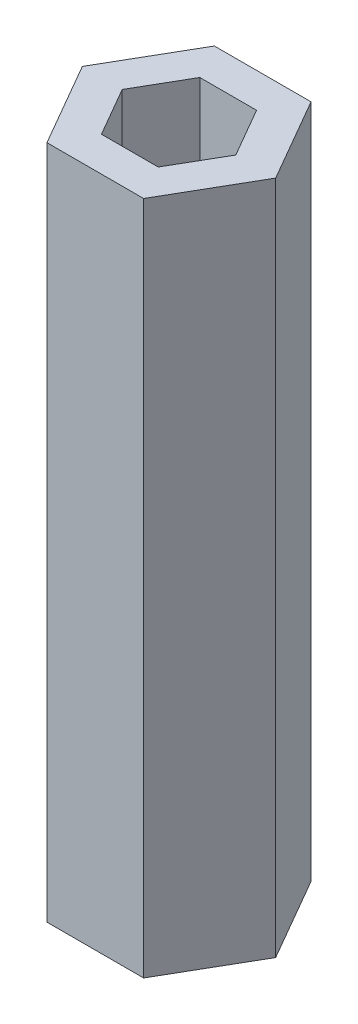
ISO-10303-21;
HEADER;
FILE_DESCRIPTION(('STEP AP214'),'2;1');
FILE_NAME('part.step','',(''),(''),'','','');
FILE_SCHEMA(('AUTOMOTIVE_DESIGN { 1 0 10303 214 1 1 1 1 }'));
ENDSEC;
DATA;
#1=APPLICATION_CONTEXT('core data for automotive mechanical design processes');
#2=APPLICATION_PROTOCOL_DEFINITION('international standard','automotive_design',2000,#1);
#3=PRODUCT_CONTEXT('',#1,'mechanical');
#4=PRODUCT('Part','Part','',(#3));
#5=PRODUCT_RELATED_PRODUCT_CATEGORY('part','',(#4));
#6=PRODUCT_DEFINITION_FORMATION('','',#4);
#7=PRODUCT_DEFINITION_CONTEXT('part definition',#1,'design');
#8=PRODUCT_DEFINITION('design','',#6,#7);
#9=PRODUCT_DEFINITION_SHAPE('','',#8);
#10=(LENGTH_UNIT() NAMED_UNIT(*) SI_UNIT(.MILLI.,.METRE.));
#11=(NAMED_UNIT(*) PLANE_ANGLE_UNIT() SI_UNIT($,.RADIAN.));
#12=(NAMED_UNIT(*) SI_UNIT($,.STERADIAN.) SOLID_ANGLE_UNIT());
#13=UNCERTAINTY_MEASURE_WITH_UNIT(LENGTH_MEASURE(1.E-05),#10,'distance_accuracy_value','');
#14=(GEOMETRIC_REPRESENTATION_CONTEXT(3) GLOBAL_UNCERTAINTY_ASSIGNED_CONTEXT((#13)) GLOBAL_UNIT_ASSIGNED_CONTEXT((#10,
#11,#12)) REPRESENTATION_CONTEXT('',''));
#15=CARTESIAN_POINT('',(0.,0.,0.));
#16=DIRECTION('',(0.,0.,1.));
#17=DIRECTION('',(1.,0.,0.));
#18=AXIS2_PLACEMENT_3D('',#15,#16,#17);
#19=CARTESIAN_POINT('',(0.,50.8,0.));
#20=DIRECTION('',(0.,1.,0.));
#21=DIRECTION('',(0.,0.,1.));
#22=AXIS2_PLACEMENT_3D('',#19,#20,#21);
#23=PLANE('',#22);
#24=DIRECTION('',(-1.,0.,0.));
#25=VECTOR('',#24,1.);
#26=CARTESIAN_POINT('',(3.63730669589464,50.8,-6.3));
#27=LINE('',#26,#25);
#28=CARTESIAN_POINT('',(3.63730669589464,50.8,-6.3));
#29=VERTEX_POINT('',#28);
#30=CARTESIAN_POINT('',(-3.63730669589464,50.8,-6.3));
#31=VERTEX_POINT('',#30);
#32=EDGE_CURVE('E204',#29,#31,#27,.T.);
#33=ORIENTED_EDGE('',*,*,#32,.T.);
#34=DIRECTION('',(-0.499999999999999,0.,0.866025403784439));
#35=VECTOR('',#34,1.);
#36=CARTESIAN_POINT('',(-3.63730669589464,50.8,-6.3));
#37=LINE('',#36,#35);
#38=CARTESIAN_POINT('',(-7.27461339178928,50.8,0.));
#39=VERTEX_POINT('',#38);
#40=EDGE_CURVE('E208',#31,#39,#37,.T.);
#41=ORIENTED_EDGE('',*,*,#40,.T.);
#42=DIRECTION('',(0.5,0.,0.866025403784438));
#43=VECTOR('',#42,1.);
#44=CARTESIAN_POINT('',(-7.27461339178928,50.8,0.));
#45=LINE('',#44,#43);
#46=CARTESIAN_POINT('',(-3.63730669589464,50.8,6.3));
#47=VERTEX_POINT('',#46);
#48=EDGE_CURVE('E212',#39,#47,#45,.T.);
#49=ORIENTED_EDGE('',*,*,#48,.T.);
#50=DIRECTION('',(1.,0.,0.));
#51=VECTOR('',#50,1.);
#52=CARTESIAN_POINT('',(-3.63730669589464,50.8,6.3));
#53=LINE('',#52,#51);
#54=CARTESIAN_POINT('',(3.63730669589465,50.8,6.3));
#55=VERTEX_POINT('',#54);
#56=EDGE_CURVE('E215',#47,#55,#53,.T.);
#57=ORIENTED_EDGE('',*,*,#56,.T.);
#58=DIRECTION('',(0.5,0.,-0.866025403784439));
#59=VECTOR('',#58,1.);
#60=CARTESIAN_POINT('',(3.63730669589465,50.8,6.3));
#61=LINE('',#60,#59);
#62=CARTESIAN_POINT('',(7.27461339178929,50.8,0.));
#63=VERTEX_POINT('',#62);
#64=EDGE_CURVE('E218',#55,#63,#61,.T.);
#65=ORIENTED_EDGE('',*,*,#64,.T.);
#66=DIRECTION('',(-0.5,0.,-0.866025403784438));
#67=VECTOR('',#66,1.);
#68=CARTESIAN_POINT('',(7.27461339178929,50.8,0.));
#69=LINE('',#68,#67);
#70=EDGE_CURVE('E221',#63,#29,#69,.T.);
#71=ORIENTED_EDGE('',*,*,#70,.T.);
#72=EDGE_LOOP('',(#33,#41,#49,#57,#65,#71));
#73=FACE_BOUND('',#72,.T.);
#74=DIRECTION('',(-1.,0.,0.));
#75=VECTOR('',#74,1.);
#76=CARTESIAN_POINT('',(2.13619599600162,50.8,-3.7));
#77=LINE('',#76,#75);
#78=CARTESIAN_POINT('',(2.13619599600162,50.8,-3.7));
#79=VERTEX_POINT('',#78);
#80=CARTESIAN_POINT('',(-2.13619599600162,50.8,-3.7));
#81=VERTEX_POINT('',#80);
#82=EDGE_CURVE('E144',#79,#81,#77,.T.);
#83=ORIENTED_EDGE('',*,*,#82,.F.);
#84=DIRECTION('',(-0.5,0.,-0.866025403784439));
#85=VECTOR('',#84,1.);
#86=CARTESIAN_POINT('',(4.27239199200323,50.8,0.));
#87=LINE('',#86,#85);
#88=CARTESIAN_POINT('',(4.27239199200323,50.8,0.));
#89=VERTEX_POINT('',#88);
#90=EDGE_CURVE('E135',#89,#79,#87,.T.);
#91=ORIENTED_EDGE('',*,*,#90,.F.);
#92=DIRECTION('',(0.5,0.,-0.866025403784439));
#93=VECTOR('',#92,1.);
#94=CARTESIAN_POINT('',(2.13619599600162,50.8,3.7));
#95=LINE('',#94,#93);
#96=CARTESIAN_POINT('',(2.13619599600162,50.8,3.7));
#97=VERTEX_POINT('',#96);
#98=EDGE_CURVE('E170',#97,#89,#95,.T.);
#99=ORIENTED_EDGE('',*,*,#98,.F.);
#100=DIRECTION('',(1.,0.,0.));
#101=VECTOR('',#100,1.);
#102=CARTESIAN_POINT('',(-2.13619599600161,50.8,3.7));
#103=LINE('',#102,#101);
#104=CARTESIAN_POINT('',(-2.13619599600161,50.8,3.7));
#105=VERTEX_POINT('',#104);
#106=EDGE_CURVE('E167',#105,#97,#103,.T.);
#107=ORIENTED_EDGE('',*,*,#106,.F.);
#108=DIRECTION('',(0.5,0.,0.866025403784438));
#109=VECTOR('',#108,1.);
#110=CARTESIAN_POINT('',(-4.27239199200323,50.8,0.));
#111=LINE('',#110,#109);
#112=CARTESIAN_POINT('',(-4.27239199200323,50.8,0.));
#113=VERTEX_POINT('',#112);
#114=EDGE_CURVE('E162',#113,#105,#111,.T.);
#115=ORIENTED_EDGE('',*,*,#114,.F.);
#116=DIRECTION('',(-0.5,0.,0.866025403784439));
#117=VECTOR('',#116,1.);
#118=CARTESIAN_POINT('',(-2.13619599600162,50.8,-3.7));
#119=LINE('',#118,#117);
#120=EDGE_CURVE('E158',#81,#113,#119,.T.);
#121=ORIENTED_EDGE('',*,*,#120,.F.);
#122=EDGE_LOOP('',(#83,#91,#99,#107,#115,#121));
#123=FACE_BOUND('',#122,.T.);
#124=ADVANCED_FACE('F45',(#73,#123),#23,.T.);
#125=CARTESIAN_POINT('',(0.,0.,0.));
#126=DIRECTION('',(0.,1.,0.));
#127=DIRECTION('',(0.,0.,1.));
#128=AXIS2_PLACEMENT_3D('',#125,#126,#127);
#129=PLANE('',#128);
#130=DIRECTION('',(-1.,0.,0.));
#131=VECTOR('',#130,1.);
#132=CARTESIAN_POINT('',(3.63730669589464,0.,-6.3));
#133=LINE('',#132,#131);
#134=CARTESIAN_POINT('',(3.63730669589464,0.,-6.3));
#135=VERTEX_POINT('',#134);
#136=CARTESIAN_POINT('',(-3.63730669589464,0.,-6.3));
#137=VERTEX_POINT('',#136);
#138=EDGE_CURVE('E153',#135,#137,#133,.T.);
#139=ORIENTED_EDGE('',*,*,#138,.F.);
#140=DIRECTION('',(-0.5,0.,-0.866025403784438));
#141=VECTOR('',#140,1.);
#142=CARTESIAN_POINT('',(7.27461339178929,0.,0.));
#143=LINE('',#142,#141);
#144=CARTESIAN_POINT('',(7.27461339178929,0.,0.));
#145=VERTEX_POINT('',#144);
#146=EDGE_CURVE('E209',#145,#135,#143,.T.);
#147=ORIENTED_EDGE('',*,*,#146,.F.);
#148=DIRECTION('',(0.5,0.,-0.866025403784439));
#149=VECTOR('',#148,1.);
#150=CARTESIAN_POINT('',(3.63730669589465,0.,6.3));
#151=LINE('',#150,#149);
#152=CARTESIAN_POINT('',(3.63730669589465,0.,6.3));
#153=VERTEX_POINT('',#152);
#154=EDGE_CURVE('E237',#153,#145,#151,.T.);
#155=ORIENTED_EDGE('',*,*,#154,.F.);
#156=DIRECTION('',(1.,0.,0.));
#157=VECTOR('',#156,1.);
#158=CARTESIAN_POINT('',(-3.63730669589464,0.,6.3));
#159=LINE('',#158,#157);
#160=CARTESIAN_POINT('',(-3.63730669589464,0.,6.3));
#161=VERTEX_POINT('',#160);
#162=EDGE_CURVE('E234',#161,#153,#159,.T.);
#163=ORIENTED_EDGE('',*,*,#162,.F.);
#164=DIRECTION('',(0.5,0.,0.866025403784438));
#165=VECTOR('',#164,1.);
#166=CARTESIAN_POINT('',(-7.27461339178928,0.,0.));
#167=LINE('',#166,#165);
#168=CARTESIAN_POINT('',(-7.27461339178928,0.,0.));
#169=VERTEX_POINT('',#168);
#170=EDGE_CURVE('E231',#169,#161,#167,.T.);
#171=ORIENTED_EDGE('',*,*,#170,.F.);
#172=DIRECTION('',(-0.499999999999999,0.,0.866025403784439));
#173=VECTOR('',#172,1.);
#174=CARTESIAN_POINT('',(-3.63730669589464,0.,-6.3));
#175=LINE('',#174,#173);
#176=EDGE_CURVE('E228',#137,#169,#175,.T.);
#177=ORIENTED_EDGE('',*,*,#176,.F.);
#178=EDGE_LOOP('',(#139,#147,#155,#163,#171,#177));
#179=FACE_BOUND('',#178,.T.);
#180=DIRECTION('',(-0.5,0.,-0.866025403784439));
#181=VECTOR('',#180,1.);
#182=CARTESIAN_POINT('',(4.27239199200323,0.,0.));
#183=LINE('',#182,#181);
#184=CARTESIAN_POINT('',(4.27239199200323,0.,0.));
#185=VERTEX_POINT('',#184);
#186=CARTESIAN_POINT('',(2.13619599600162,0.,-3.7));
#187=VERTEX_POINT('',#186);
#188=EDGE_CURVE('E69',#185,#187,#183,.T.);
#189=ORIENTED_EDGE('',*,*,#188,.T.);
#190=DIRECTION('',(-1.,0.,0.));
#191=VECTOR('',#190,1.);
#192=CARTESIAN_POINT('',(2.13619599600162,0.,-3.7));
#193=LINE('',#192,#191);
#194=CARTESIAN_POINT('',(-2.13619599600162,0.,-3.7));
#195=VERTEX_POINT('',#194);
#196=EDGE_CURVE('E151',#187,#195,#193,.T.);
#197=ORIENTED_EDGE('',*,*,#196,.T.);
#198=DIRECTION('',(-0.5,0.,0.866025403784439));
#199=VECTOR('',#198,1.);
#200=CARTESIAN_POINT('',(-2.13619599600162,0.,-3.7));
#201=LINE('',#200,#199);
#202=CARTESIAN_POINT('',(-4.27239199200323,0.,0.));
#203=VERTEX_POINT('',#202);
#204=EDGE_CURVE('E177',#195,#203,#201,.T.);
#205=ORIENTED_EDGE('',*,*,#204,.T.);
#206=DIRECTION('',(0.5,0.,0.866025403784438));
#207=VECTOR('',#206,1.);
#208=CARTESIAN_POINT('',(-4.27239199200323,0.,0.));
#209=LINE('',#208,#207);
#210=CARTESIAN_POINT('',(-2.13619599600161,0.,3.7));
#211=VERTEX_POINT('',#210);
#212=EDGE_CURVE('E181',#203,#211,#209,.T.);
#213=ORIENTED_EDGE('',*,*,#212,.T.);
#214=DIRECTION('',(1.,0.,0.));
#215=VECTOR('',#214,1.);
#216=CARTESIAN_POINT('',(-2.13619599600161,0.,3.7));
#217=LINE('',#216,#215);
#218=CARTESIAN_POINT('',(2.13619599600162,0.,3.7));
#219=VERTEX_POINT('',#218);
#220=EDGE_CURVE('E185',#211,#219,#217,.T.);
#221=ORIENTED_EDGE('',*,*,#220,.T.);
#222=DIRECTION('',(0.5,0.,-0.866025403784439));
#223=VECTOR('',#222,1.);
#224=CARTESIAN_POINT('',(2.13619599600162,0.,3.7));
#225=LINE('',#224,#223);
#226=EDGE_CURVE('E145',#219,#185,#225,.T.);
#227=ORIENTED_EDGE('',*,*,#226,.T.);
#228=EDGE_LOOP('',(#189,#197,#205,#213,#221,#227));
#229=FACE_BOUND('',#228,.T.);
#230=ADVANCED_FACE('F268',(#179,#229),#129,.F.);
#231=CARTESIAN_POINT('',(3.63730669589464,50.8,-6.3));
#232=DIRECTION('',(0.,0.,1.));
#233=DIRECTION('',(1.,0.,0.));
#234=AXIS2_PLACEMENT_3D('',#231,#232,#233);
#235=PLANE('',#234);
#236=ORIENTED_EDGE('',*,*,#138,.T.);
#237=DIRECTION('',(0.,-1.,0.));
#238=VECTOR('',#237,1.);
#239=CARTESIAN_POINT('',(-3.63730669589464,50.8,-6.3));
#240=LINE('',#239,#238);
#241=EDGE_CURVE('E11',#31,#137,#240,.T.);
#242=ORIENTED_EDGE('',*,*,#241,.F.);
#243=ORIENTED_EDGE('',*,*,#32,.F.);
#244=DIRECTION('',(0.,-1.,0.));
#245=VECTOR('',#244,1.);
#246=CARTESIAN_POINT('',(3.63730669589464,50.8,-6.3));
#247=LINE('',#246,#245);
#248=EDGE_CURVE('E224',#29,#135,#247,.T.);
#249=ORIENTED_EDGE('',*,*,#248,.T.);
#250=EDGE_LOOP('',(#236,#242,#243,#249));
#251=FACE_BOUND('',#250,.T.);
#252=ADVANCED_FACE('F47',(#251),#235,.F.);
#253=CARTESIAN_POINT('',(-3.63730669589464,50.8,-6.3));
#254=DIRECTION('',(0.866025403784439,0.,0.499999999999999));
#255=DIRECTION('',(0.5,0.,-0.866025403784439));
#256=AXIS2_PLACEMENT_3D('',#253,#254,#255);
#257=PLANE('',#256);
#258=ORIENTED_EDGE('',*,*,#176,.T.);
#259=DIRECTION('',(0.,-1.,0.));
#260=VECTOR('',#259,1.);
#261=CARTESIAN_POINT('',(-7.27461339178928,50.8,0.));
#262=LINE('',#261,#260);
#263=EDGE_CURVE('E54',#39,#169,#262,.T.);
#264=ORIENTED_EDGE('',*,*,#263,.F.);
#265=ORIENTED_EDGE('',*,*,#40,.F.);
#266=ORIENTED_EDGE('',*,*,#241,.T.);
#267=EDGE_LOOP('',(#258,#264,#265,#266));
#268=FACE_BOUND('',#267,.T.);
#269=ADVANCED_FACE('F285',(#268),#257,.F.);
#270=CARTESIAN_POINT('',(-7.27461339178928,50.8,0.));
#271=DIRECTION('',(0.866025403784438,0.,-0.5));
#272=DIRECTION('',(-0.500000000000001,0.,-0.866025403784438));
#273=AXIS2_PLACEMENT_3D('',#270,#271,#272);
#274=PLANE('',#273);
#275=ORIENTED_EDGE('',*,*,#170,.T.);
#276=DIRECTION('',(0.,-1.,0.));
#277=VECTOR('',#276,1.);
#278=CARTESIAN_POINT('',(-3.63730669589464,50.8,6.3));
#279=LINE('',#278,#277);
#280=EDGE_CURVE('E253',#47,#161,#279,.T.);
#281=ORIENTED_EDGE('',*,*,#280,.F.);
#282=ORIENTED_EDGE('',*,*,#48,.F.);
#283=ORIENTED_EDGE('',*,*,#263,.T.);
#284=EDGE_LOOP('',(#275,#281,#282,#283));
#285=FACE_BOUND('',#284,.T.);
#286=ADVANCED_FACE('F262',(#285),#274,.F.);
#287=CARTESIAN_POINT('',(-3.63730669589464,50.8,6.3));
#288=DIRECTION('',(0.,0.,-1.));
#289=DIRECTION('',(-1.,0.,0.));
#290=AXIS2_PLACEMENT_3D('',#287,#288,#289);
#291=PLANE('',#290);
#292=ORIENTED_EDGE('',*,*,#162,.T.);
#293=DIRECTION('',(0.,-1.,0.));
#294=VECTOR('',#293,1.);
#295=CARTESIAN_POINT('',(3.63730669589465,50.8,6.3));
#296=LINE('',#295,#294);
#297=EDGE_CURVE('E249',#55,#153,#296,.T.);
#298=ORIENTED_EDGE('',*,*,#297,.F.);
#299=ORIENTED_EDGE('',*,*,#56,.F.);
#300=ORIENTED_EDGE('',*,*,#280,.T.);
#301=EDGE_LOOP('',(#292,#298,#299,#300));
#302=FACE_BOUND('',#301,.T.);
#303=ADVANCED_FACE('F274',(#302),#291,.F.);
#304=CARTESIAN_POINT('',(3.63730669589465,50.8,6.3));
#305=DIRECTION('',(-0.866025403784439,0.,-0.5));
#306=DIRECTION('',(-0.5,0.,0.866025403784439));
#307=AXIS2_PLACEMENT_3D('',#304,#305,#306);
#308=PLANE('',#307);
#309=ORIENTED_EDGE('',*,*,#154,.T.);
#310=DIRECTION('',(0.,-1.,0.));
#311=VECTOR('',#310,1.);
#312=CARTESIAN_POINT('',(7.27461339178929,50.8,0.));
#313=LINE('',#312,#311);
#314=EDGE_CURVE('E245',#63,#145,#313,.T.);
#315=ORIENTED_EDGE('',*,*,#314,.F.);
#316=ORIENTED_EDGE('',*,*,#64,.F.);
#317=ORIENTED_EDGE('',*,*,#297,.T.);
#318=EDGE_LOOP('',(#309,#315,#316,#317));
#319=FACE_BOUND('',#318,.T.);
#320=ADVANCED_FACE('F278',(#319),#308,.F.);
#321=CARTESIAN_POINT('',(7.27461339178929,50.8,0.));
#322=DIRECTION('',(-0.866025403784439,0.,0.5));
#323=DIRECTION('',(0.5,0.,0.866025403784439));
#324=AXIS2_PLACEMENT_3D('',#321,#322,#323);
#325=PLANE('',#324);
#326=ORIENTED_EDGE('',*,*,#146,.T.);
#327=ORIENTED_EDGE('',*,*,#248,.F.);
#328=ORIENTED_EDGE('',*,*,#70,.F.);
#329=ORIENTED_EDGE('',*,*,#314,.T.);
#330=EDGE_LOOP('',(#326,#327,#328,#329));
#331=FACE_BOUND('',#330,.T.);
#332=ADVANCED_FACE('F288',(#331),#325,.F.);
#333=CARTESIAN_POINT('',(4.27239199200323,50.8,0.));
#334=DIRECTION('',(-0.866025403784439,0.,0.5));
#335=DIRECTION('',(0.5,0.,0.866025403784439));
#336=AXIS2_PLACEMENT_3D('',#333,#334,#335);
#337=PLANE('',#336);
#338=ORIENTED_EDGE('',*,*,#188,.F.);
#339=DIRECTION('',(0.,-1.,0.));
#340=VECTOR('',#339,1.);
#341=CARTESIAN_POINT('',(4.27239199200323,50.8,0.));
#342=LINE('',#341,#340);
#343=EDGE_CURVE('E139',#89,#185,#342,.T.);
#344=ORIENTED_EDGE('',*,*,#343,.F.);
#345=ORIENTED_EDGE('',*,*,#90,.T.);
#346=DIRECTION('',(0.,-1.,0.));
#347=VECTOR('',#346,1.);
#348=CARTESIAN_POINT('',(2.13619599600162,50.8,-3.7));
#349=LINE('',#348,#347);
#350=EDGE_CURVE('E138',#79,#187,#349,.T.);
#351=ORIENTED_EDGE('',*,*,#350,.T.);
#352=EDGE_LOOP('',(#338,#344,#345,#351));
#353=FACE_BOUND('',#352,.T.);
#354=ADVANCED_FACE('F137',(#353),#337,.T.);
#355=CARTESIAN_POINT('',(2.13619599600162,50.8,-3.7));
#356=DIRECTION('',(0.,0.,1.));
#357=DIRECTION('',(1.,0.,0.));
#358=AXIS2_PLACEMENT_3D('',#355,#356,#357);
#359=PLANE('',#358);
#360=ORIENTED_EDGE('',*,*,#196,.F.);
#361=ORIENTED_EDGE('',*,*,#350,.F.);
#362=ORIENTED_EDGE('',*,*,#82,.T.);
#363=DIRECTION('',(0.,-1.,0.));
#364=VECTOR('',#363,1.);
#365=CARTESIAN_POINT('',(-2.13619599600162,50.8,-3.7));
#366=LINE('',#365,#364);
#367=EDGE_CURVE('E154',#81,#195,#366,.T.);
#368=ORIENTED_EDGE('',*,*,#367,.T.);
#369=EDGE_LOOP('',(#360,#361,#362,#368));
#370=FACE_BOUND('',#369,.T.);
#371=ADVANCED_FACE('F148',(#370),#359,.T.);
#372=CARTESIAN_POINT('',(-2.13619599600162,50.8,-3.7));
#373=DIRECTION('',(0.866025403784439,0.,0.5));
#374=DIRECTION('',(0.5,0.,-0.866025403784439));
#375=AXIS2_PLACEMENT_3D('',#372,#373,#374);
#376=PLANE('',#375);
#377=ORIENTED_EDGE('',*,*,#204,.F.);
#378=ORIENTED_EDGE('',*,*,#367,.F.);
#379=ORIENTED_EDGE('',*,*,#120,.T.);
#380=DIRECTION('',(0.,-1.,0.));
#381=VECTOR('',#380,1.);
#382=CARTESIAN_POINT('',(-4.27239199200323,50.8,0.));
#383=LINE('',#382,#381);
#384=EDGE_CURVE('E199',#113,#203,#383,.T.);
#385=ORIENTED_EDGE('',*,*,#384,.T.);
#386=EDGE_LOOP('',(#377,#378,#379,#385));
#387=FACE_BOUND('',#386,.T.);
#388=ADVANCED_FACE('F306',(#387),#376,.T.);
#389=CARTESIAN_POINT('',(-4.27239199200323,50.8,0.));
#390=DIRECTION('',(0.866025403784438,0.,-0.5));
#391=DIRECTION('',(-0.5,0.,-0.866025403784439));
#392=AXIS2_PLACEMENT_3D('',#389,#390,#391);
#393=PLANE('',#392);
#394=ORIENTED_EDGE('',*,*,#212,.F.);
#395=ORIENTED_EDGE('',*,*,#384,.F.);
#396=ORIENTED_EDGE('',*,*,#114,.T.);
#397=DIRECTION('',(0.,-1.,0.));
#398=VECTOR('',#397,1.);
#399=CARTESIAN_POINT('',(-2.13619599600161,50.8,3.7));
#400=LINE('',#399,#398);
#401=EDGE_CURVE('E196',#105,#211,#400,.T.);
#402=ORIENTED_EDGE('',*,*,#401,.T.);
#403=EDGE_LOOP('',(#394,#395,#396,#402));
#404=FACE_BOUND('',#403,.T.);
#405=ADVANCED_FACE('F309',(#404),#393,.T.);
#406=CARTESIAN_POINT('',(-2.13619599600161,50.8,3.7));
#407=DIRECTION('',(0.,0.,-1.));
#408=DIRECTION('',(-1.,0.,0.));
#409=AXIS2_PLACEMENT_3D('',#406,#407,#408);
#410=PLANE('',#409);
#411=ORIENTED_EDGE('',*,*,#220,.F.);
#412=ORIENTED_EDGE('',*,*,#401,.F.);
#413=ORIENTED_EDGE('',*,*,#106,.T.);
#414=DIRECTION('',(0.,-1.,0.));
#415=VECTOR('',#414,1.);
#416=CARTESIAN_POINT('',(2.13619599600162,50.8,3.7));
#417=LINE('',#416,#415);
#418=EDGE_CURVE('E61',#97,#219,#417,.T.);
#419=ORIENTED_EDGE('',*,*,#418,.T.);
#420=EDGE_LOOP('',(#411,#412,#413,#419));
#421=FACE_BOUND('',#420,.T.);
#422=ADVANCED_FACE('F313',(#421),#410,.T.);
#423=CARTESIAN_POINT('',(2.13619599600162,50.8,3.7));
#424=DIRECTION('',(-0.866025403784439,0.,-0.5));
#425=DIRECTION('',(-0.5,0.,0.866025403784439));
#426=AXIS2_PLACEMENT_3D('',#423,#424,#425);
#427=PLANE('',#426);
#428=ORIENTED_EDGE('',*,*,#226,.F.);
#429=ORIENTED_EDGE('',*,*,#418,.F.);
#430=ORIENTED_EDGE('',*,*,#98,.T.);
#431=ORIENTED_EDGE('',*,*,#343,.T.);
#432=EDGE_LOOP('',(#428,#429,#430,#431));
#433=FACE_BOUND('',#432,.T.);
#434=ADVANCED_FACE('F317',(#433),#427,.T.);
#435=CLOSED_SHELL('',(#124,#230,#252,#269,#286,#303,#320,#332,#354,#371,#388,#405,#422,#434));
#436=MANIFOLD_SOLID_BREP('B2',#435);
#437=ADVANCED_BREP_SHAPE_REPRESENTATION('',(#18,#436),#14);
#438=SHAPE_DEFINITION_REPRESENTATION(#9,#437);
ENDSEC;
END-ISO-10303-21;
